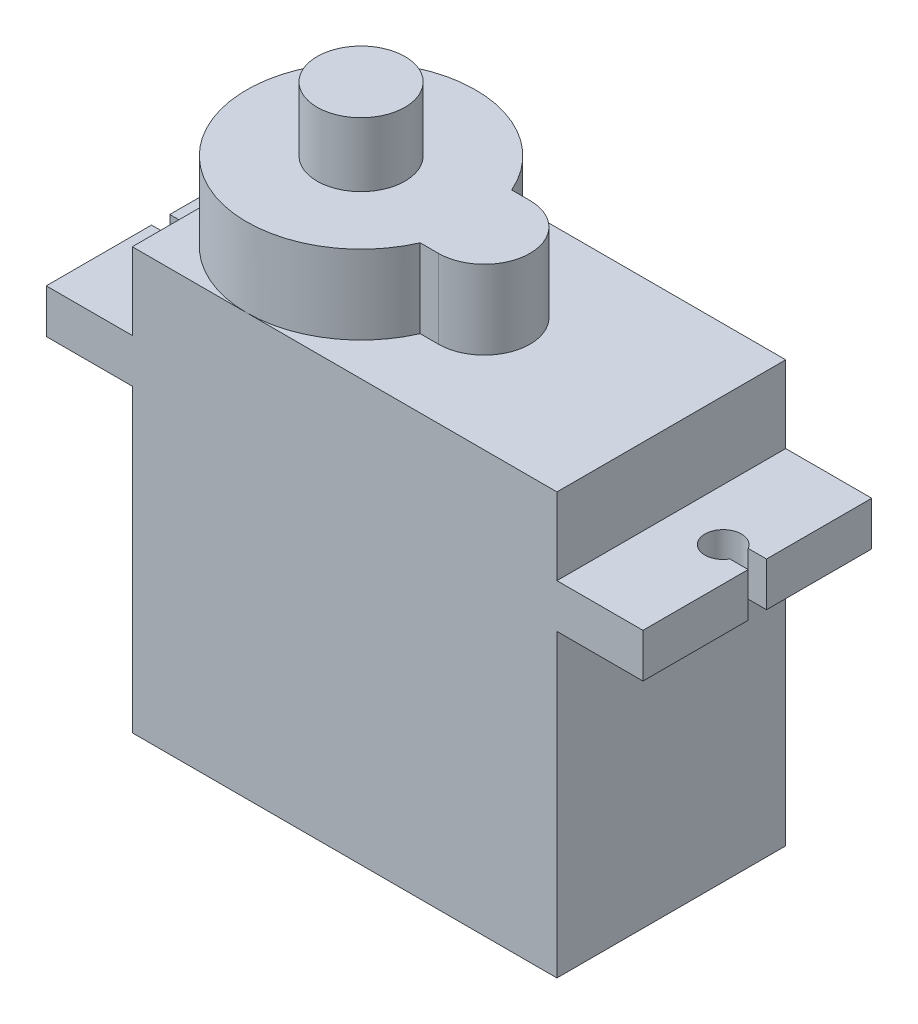
ISO-10303-21;
HEADER;
FILE_DESCRIPTION(('STEP AP214'),'2;1');
FILE_NAME('part.step','',(''),(''),'','','');
FILE_SCHEMA(('AUTOMOTIVE_DESIGN { 1 0 10303 214 1 1 1 1 }'));
ENDSEC;
DATA;
#1=APPLICATION_CONTEXT('core data for automotive mechanical design processes');
#2=APPLICATION_PROTOCOL_DEFINITION('international standard','automotive_design',2000,#1);
#3=PRODUCT_CONTEXT('',#1,'mechanical');
#4=PRODUCT('Part','Part','',(#3));
#5=PRODUCT_RELATED_PRODUCT_CATEGORY('part','',(#4));
#6=PRODUCT_DEFINITION_FORMATION('','',#4);
#7=PRODUCT_DEFINITION_CONTEXT('part definition',#1,'design');
#8=PRODUCT_DEFINITION('design','',#6,#7);
#9=PRODUCT_DEFINITION_SHAPE('','',#8);
#10=(LENGTH_UNIT() NAMED_UNIT(*) SI_UNIT(.MILLI.,.METRE.));
#11=(NAMED_UNIT(*) PLANE_ANGLE_UNIT() SI_UNIT($,.RADIAN.));
#12=(NAMED_UNIT(*) SI_UNIT($,.STERADIAN.) SOLID_ANGLE_UNIT());
#13=UNCERTAINTY_MEASURE_WITH_UNIT(LENGTH_MEASURE(1.E-05),#10,'distance_accuracy_value','');
#14=(GEOMETRIC_REPRESENTATION_CONTEXT(3) GLOBAL_UNCERTAINTY_ASSIGNED_CONTEXT((#13)) GLOBAL_UNIT_ASSIGNED_CONTEXT((#10,
#11,#12)) REPRESENTATION_CONTEXT('',''));
#15=CARTESIAN_POINT('',(0.,0.,0.));
#16=DIRECTION('',(0.,0.,1.));
#17=DIRECTION('',(1.,0.,0.));
#18=AXIS2_PLACEMENT_3D('',#15,#16,#17);
#19=CARTESIAN_POINT('',(27.9,16.4,12.5));
#20=DIRECTION('',(-1.,0.,0.));
#21=DIRECTION('',(0.,0.,1.));
#22=AXIS2_PLACEMENT_3D('',#19,#20,#21);
#23=PLANE('',#22);
#24=DIRECTION('',(0.,0.,-1.));
#25=VECTOR('',#24,1.);
#26=CARTESIAN_POINT('',(27.9,18.8,12.5));
#27=LINE('',#26,#25);
#28=CARTESIAN_POINT('',(27.9,18.8,5.75));
#29=VERTEX_POINT('',#28);
#30=CARTESIAN_POINT('',(27.9,18.8,0.));
#31=VERTEX_POINT('',#30);
#32=EDGE_CURVE('E268',#29,#31,#27,.T.);
#33=ORIENTED_EDGE('',*,*,#32,.F.);
#34=DIRECTION('',(0.,1.,0.));
#35=VECTOR('',#34,1.);
#36=CARTESIAN_POINT('',(27.9,-0.001000000000001,5.75));
#37=LINE('',#36,#35);
#38=CARTESIAN_POINT('',(27.9,16.4,5.75));
#39=VERTEX_POINT('',#38);
#40=EDGE_CURVE('E435',#39,#29,#37,.T.);
#41=ORIENTED_EDGE('',*,*,#40,.F.);
#42=DIRECTION('',(0.,0.,-1.));
#43=VECTOR('',#42,1.);
#44=CARTESIAN_POINT('',(27.9,16.4,12.5));
#45=LINE('',#44,#43);
#46=CARTESIAN_POINT('',(27.9,16.4,0.));
#47=VERTEX_POINT('',#46);
#48=EDGE_CURVE('E273',#39,#47,#45,.T.);
#49=ORIENTED_EDGE('',*,*,#48,.T.);
#50=DIRECTION('',(0.,1.,0.));
#51=VECTOR('',#50,1.);
#52=CARTESIAN_POINT('',(27.9,16.4,0.));
#53=LINE('',#52,#51);
#54=EDGE_CURVE('E417',#47,#31,#53,.T.);
#55=ORIENTED_EDGE('',*,*,#54,.T.);
#56=EDGE_LOOP('',(#33,#41,#49,#55));
#57=FACE_BOUND('',#56,.T.);
#58=ADVANCED_FACE('F39',(#57),#23,.F.);
#59=CARTESIAN_POINT('',(-4.7,18.8,12.5));
#60=DIRECTION('',(1.,0.,0.));
#61=DIRECTION('',(0.,1.,0.));
#62=AXIS2_PLACEMENT_3D('',#59,#60,#61);
#63=PLANE('',#62);
#64=DIRECTION('',(0.,0.,-1.));
#65=VECTOR('',#64,1.);
#66=CARTESIAN_POINT('',(-4.7,16.4,12.5));
#67=LINE('',#66,#65);
#68=CARTESIAN_POINT('',(-4.7,16.4,5.75));
#69=VERTEX_POINT('',#68);
#70=CARTESIAN_POINT('',(-4.7,16.4,0.));
#71=VERTEX_POINT('',#70);
#72=EDGE_CURVE('E241',#69,#71,#67,.T.);
#73=ORIENTED_EDGE('',*,*,#72,.F.);
#74=DIRECTION('',(0.,1.,0.));
#75=VECTOR('',#74,1.);
#76=CARTESIAN_POINT('',(-4.7,-0.001000000000001,5.75));
#77=LINE('',#76,#75);
#78=CARTESIAN_POINT('',(-4.7,18.8,5.75));
#79=VERTEX_POINT('',#78);
#80=EDGE_CURVE('E222',#69,#79,#77,.T.);
#81=ORIENTED_EDGE('',*,*,#80,.T.);
#82=DIRECTION('',(0.,0.,-1.));
#83=VECTOR('',#82,1.);
#84=CARTESIAN_POINT('',(-4.7,18.8,12.5));
#85=LINE('',#84,#83);
#86=CARTESIAN_POINT('',(-4.7,18.8,0.));
#87=VERTEX_POINT('',#86);
#88=EDGE_CURVE('E240',#79,#87,#85,.T.);
#89=ORIENTED_EDGE('',*,*,#88,.T.);
#90=DIRECTION('',(0.,-1.,0.));
#91=VECTOR('',#90,1.);
#92=CARTESIAN_POINT('',(-4.7,18.8,0.));
#93=LINE('',#92,#91);
#94=EDGE_CURVE('E353',#87,#71,#93,.T.);
#95=ORIENTED_EDGE('',*,*,#94,.T.);
#96=EDGE_LOOP('',(#73,#81,#89,#95));
#97=FACE_BOUND('',#96,.T.);
#98=ADVANCED_FACE('F474',(#97),#63,.F.);
#99=CARTESIAN_POINT('',(0.,23.,12.5));
#100=DIRECTION('',(0.,-1.,0.));
#101=DIRECTION('',(0.,0.,-1.));
#102=AXIS2_PLACEMENT_3D('',#99,#100,#101);
#103=PLANE('',#102);
#104=CARTESIAN_POINT('',(6.25,23.,6.25));
#105=DIRECTION('',(0.,1.,0.));
#106=DIRECTION('',(0.,0.,1.));
#107=AXIS2_PLACEMENT_3D('',#104,#105,#106);
#108=CIRCLE('',#107,6.25);
#109=CARTESIAN_POINT('',(11.9782196186948,23.,3.75));
#110=VERTEX_POINT('',#109);
#111=CARTESIAN_POINT('',(6.25,23.,0.));
#112=VERTEX_POINT('',#111);
#113=EDGE_CURVE('E298',#110,#112,#108,.T.);
#114=ORIENTED_EDGE('',*,*,#113,.F.);
#115=DIRECTION('',(-1.,0.,0.));
#116=VECTOR('',#115,1.);
#117=CARTESIAN_POINT('',(11.9782196186948,23.,3.75));
#118=LINE('',#117,#116);
#119=CARTESIAN_POINT('',(12.9782196186948,23.,3.75));
#120=VERTEX_POINT('',#119);
#121=EDGE_CURVE('E765',#120,#110,#118,.T.);
#122=ORIENTED_EDGE('',*,*,#121,.F.);
#123=CARTESIAN_POINT('',(12.9782196186948,23.,6.25));
#124=DIRECTION('',(0.,1.,0.));
#125=DIRECTION('',(0.,0.,1.));
#126=AXIS2_PLACEMENT_3D('',#123,#124,#125);
#127=CIRCLE('',#126,2.5);
#128=CARTESIAN_POINT('',(12.9782196186948,23.,8.75));
#129=VERTEX_POINT('',#128);
#130=EDGE_CURVE('E314',#129,#120,#127,.T.);
#131=ORIENTED_EDGE('',*,*,#130,.F.);
#132=DIRECTION('',(1.,0.,0.));
#133=VECTOR('',#132,1.);
#134=CARTESIAN_POINT('',(11.9782196186948,23.,8.75));
#135=LINE('',#134,#133);
#136=CARTESIAN_POINT('',(11.9782196186948,23.,8.75));
#137=VERTEX_POINT('',#136);
#138=EDGE_CURVE('E308',#137,#129,#135,.T.);
#139=ORIENTED_EDGE('',*,*,#138,.F.);
#140=CARTESIAN_POINT('',(6.25,23.,12.5));
#141=VERTEX_POINT('',#140);
#142=EDGE_CURVE('E290',#141,#137,#108,.T.);
#143=ORIENTED_EDGE('',*,*,#142,.F.);
#144=DIRECTION('',(-1.,0.,0.));
#145=VECTOR('',#144,1.);
#146=CARTESIAN_POINT('',(0.,23.,12.5));
#147=LINE('',#146,#145);
#148=CARTESIAN_POINT('',(23.2,23.,12.5));
#149=VERTEX_POINT('',#148);
#150=EDGE_CURVE('E389',#149,#141,#147,.T.);
#151=ORIENTED_EDGE('',*,*,#150,.F.);
#152=DIRECTION('',(0.,0.,-1.));
#153=VECTOR('',#152,1.);
#154=CARTESIAN_POINT('',(23.2,23.,12.5));
#155=LINE('',#154,#153);
#156=CARTESIAN_POINT('',(23.2,23.,0.));
#157=VERTEX_POINT('',#156);
#158=EDGE_CURVE('E260',#149,#157,#155,.T.);
#159=ORIENTED_EDGE('',*,*,#158,.T.);
#160=DIRECTION('',(-1.,0.,0.));
#161=VECTOR('',#160,1.);
#162=CARTESIAN_POINT('',(0.,23.,0.));
#163=LINE('',#162,#161);
#164=EDGE_CURVE('E332',#157,#112,#163,.T.);
#165=ORIENTED_EDGE('',*,*,#164,.T.);
#166=EDGE_LOOP('',(#114,#122,#131,#139,#143,#151,#159,#165));
#167=FACE_BOUND('',#166,.T.);
#168=ADVANCED_FACE('F339',(#167),#103,.F.);
#169=CARTESIAN_POINT('',(0.,23.,6.25));
#170=VERTEX_POINT('',#169);
#171=EDGE_CURVE('E49',#112,#170,#108,.T.);
#172=ORIENTED_EDGE('',*,*,#171,.F.);
#173=CARTESIAN_POINT('',(0.,23.,0.));
#174=VERTEX_POINT('',#173);
#175=EDGE_CURVE('E324',#112,#174,#163,.T.);
#176=ORIENTED_EDGE('',*,*,#175,.T.);
#177=DIRECTION('',(0.,0.,-1.));
#178=VECTOR('',#177,1.);
#179=CARTESIAN_POINT('',(0.,23.,12.5));
#180=LINE('',#179,#178);
#181=EDGE_CURVE('E255',#170,#174,#180,.T.);
#182=ORIENTED_EDGE('',*,*,#181,.F.);
#183=EDGE_LOOP('',(#172,#176,#182));
#184=FACE_BOUND('',#183,.T.);
#185=ADVANCED_FACE('F323',(#184),#103,.F.);
#186=EDGE_CURVE('E296',#170,#141,#108,.T.);
#187=ORIENTED_EDGE('',*,*,#186,.F.);
#188=CARTESIAN_POINT('',(0.,23.,12.5));
#189=VERTEX_POINT('',#188);
#190=EDGE_CURVE('E256',#189,#170,#180,.T.);
#191=ORIENTED_EDGE('',*,*,#190,.F.);
#192=EDGE_CURVE('E388',#141,#189,#147,.T.);
#193=ORIENTED_EDGE('',*,*,#192,.F.);
#194=EDGE_LOOP('',(#187,#191,#193));
#195=FACE_BOUND('',#194,.T.);
#196=ADVANCED_FACE('F462',(#195),#103,.F.);
#197=CARTESIAN_POINT('',(0.,16.4,12.5));
#198=DIRECTION('',(1.,0.,0.));
#199=DIRECTION('',(0.,1.,0.));
#200=AXIS2_PLACEMENT_3D('',#197,#198,#199);
#201=PLANE('',#200);
#202=DIRECTION('',(0.,-1.,0.));
#203=VECTOR('',#202,1.);
#204=CARTESIAN_POINT('',(0.,16.4,0.));
#205=LINE('',#204,#203);
#206=CARTESIAN_POINT('',(0.,16.4,0.));
#207=VERTEX_POINT('',#206);
#208=CARTESIAN_POINT('',(0.,0.,0.));
#209=VERTEX_POINT('',#208);
#210=EDGE_CURVE('E404',#207,#209,#205,.T.);
#211=ORIENTED_EDGE('',*,*,#210,.T.);
#212=DIRECTION('',(0.,0.,-1.));
#213=VECTOR('',#212,1.);
#214=CARTESIAN_POINT('',(0.,0.,12.5));
#215=LINE('',#214,#213);
#216=CARTESIAN_POINT('',(0.,0.,12.5));
#217=VERTEX_POINT('',#216);
#218=EDGE_CURVE('E43',#217,#209,#215,.T.);
#219=ORIENTED_EDGE('',*,*,#218,.F.);
#220=DIRECTION('',(0.,-1.,0.));
#221=VECTOR('',#220,1.);
#222=CARTESIAN_POINT('',(0.,16.4,12.5));
#223=LINE('',#222,#221);
#224=CARTESIAN_POINT('',(0.,16.4,12.5));
#225=VERTEX_POINT('',#224);
#226=EDGE_CURVE('E358',#225,#217,#223,.T.);
#227=ORIENTED_EDGE('',*,*,#226,.F.);
#228=DIRECTION('',(0.,0.,-1.));
#229=VECTOR('',#228,1.);
#230=CARTESIAN_POINT('',(0.,16.4,12.5));
#231=LINE('',#230,#229);
#232=EDGE_CURVE('E246',#225,#207,#231,.T.);
#233=ORIENTED_EDGE('',*,*,#232,.T.);
#234=EDGE_LOOP('',(#211,#219,#227,#233));
#235=FACE_BOUND('',#234,.T.);
#236=ADVANCED_FACE('F41',(#235),#201,.F.);
#237=CARTESIAN_POINT('',(0.,0.,12.5));
#238=DIRECTION('',(0.,1.,0.));
#239=DIRECTION('',(0.,0.,1.));
#240=AXIS2_PLACEMENT_3D('',#237,#238,#239);
#241=PLANE('',#240);
#242=DIRECTION('',(1.,0.,0.));
#243=VECTOR('',#242,1.);
#244=CARTESIAN_POINT('',(0.,0.,0.));
#245=LINE('',#244,#243);
#246=CARTESIAN_POINT('',(23.2,0.,0.));
#247=VERTEX_POINT('',#246);
#248=EDGE_CURVE('E407',#209,#247,#245,.T.);
#249=ORIENTED_EDGE('',*,*,#248,.T.);
#250=DIRECTION('',(0.,0.,-1.));
#251=VECTOR('',#250,1.);
#252=CARTESIAN_POINT('',(23.2,0.,12.5));
#253=LINE('',#252,#251);
#254=CARTESIAN_POINT('',(23.2,0.,12.5));
#255=VERTEX_POINT('',#254);
#256=EDGE_CURVE('E281',#255,#247,#253,.T.);
#257=ORIENTED_EDGE('',*,*,#256,.F.);
#258=DIRECTION('',(1.,0.,0.));
#259=VECTOR('',#258,1.);
#260=CARTESIAN_POINT('',(0.,0.,12.5));
#261=LINE('',#260,#259);
#262=EDGE_CURVE('E363',#217,#255,#261,.T.);
#263=ORIENTED_EDGE('',*,*,#262,.F.);
#264=ORIENTED_EDGE('',*,*,#218,.T.);
#265=EDGE_LOOP('',(#249,#257,#263,#264));
#266=FACE_BOUND('',#265,.T.);
#267=ADVANCED_FACE('F444',(#266),#241,.F.);
#268=CARTESIAN_POINT('',(23.2,0.,12.5));
#269=DIRECTION('',(-1.,0.,0.));
#270=DIRECTION('',(0.,0.,1.));
#271=AXIS2_PLACEMENT_3D('',#268,#269,#270);
#272=PLANE('',#271);
#273=DIRECTION('',(0.,1.,0.));
#274=VECTOR('',#273,1.);
#275=CARTESIAN_POINT('',(23.2,0.,0.));
#276=LINE('',#275,#274);
#277=CARTESIAN_POINT('',(23.2,16.4,0.));
#278=VERTEX_POINT('',#277);
#279=EDGE_CURVE('E410',#247,#278,#276,.T.);
#280=ORIENTED_EDGE('',*,*,#279,.T.);
#281=DIRECTION('',(0.,0.,-1.));
#282=VECTOR('',#281,1.);
#283=CARTESIAN_POINT('',(23.2,16.4,12.5));
#284=LINE('',#283,#282);
#285=CARTESIAN_POINT('',(23.2,16.4,12.5));
#286=VERTEX_POINT('',#285);
#287=EDGE_CURVE('E278',#286,#278,#284,.T.);
#288=ORIENTED_EDGE('',*,*,#287,.F.);
#289=DIRECTION('',(0.,1.,0.));
#290=VECTOR('',#289,1.);
#291=CARTESIAN_POINT('',(23.2,0.,12.5));
#292=LINE('',#291,#290);
#293=EDGE_CURVE('E368',#255,#286,#292,.T.);
#294=ORIENTED_EDGE('',*,*,#293,.F.);
#295=ORIENTED_EDGE('',*,*,#256,.T.);
#296=EDGE_LOOP('',(#280,#288,#294,#295));
#297=FACE_BOUND('',#296,.T.);
#298=ADVANCED_FACE('F443',(#297),#272,.F.);
#299=CARTESIAN_POINT('',(23.2,16.4,12.5));
#300=DIRECTION('',(0.,1.,0.));
#301=DIRECTION('',(0.,0.,1.));
#302=AXIS2_PLACEMENT_3D('',#299,#300,#301);
#303=PLANE('',#302);
#304=ORIENTED_EDGE('',*,*,#48,.F.);
#305=DIRECTION('',(1.,0.,0.));
#306=VECTOR('',#305,1.);
#307=CARTESIAN_POINT('',(27.9,16.4,5.75));
#308=LINE('',#307,#306);
#309=CARTESIAN_POINT('',(26.9,16.4,5.75));
#310=VERTEX_POINT('',#309);
#311=EDGE_CURVE('E737',#310,#39,#308,.T.);
#312=ORIENTED_EDGE('',*,*,#311,.F.);
#313=CARTESIAN_POINT('',(26.0339745962156,16.4,6.25));
#314=DIRECTION('',(0.,1.,0.));
#315=DIRECTION('',(0.,0.,1.));
#316=AXIS2_PLACEMENT_3D('',#313,#314,#315);
#317=CIRCLE('',#316,0.999999999999998);
#318=CARTESIAN_POINT('',(26.9,16.4,6.75));
#319=VERTEX_POINT('',#318);
#320=EDGE_CURVE('E736',#319,#310,#317,.F.);
#321=ORIENTED_EDGE('',*,*,#320,.F.);
#322=DIRECTION('',(-1.,0.,0.));
#323=VECTOR('',#322,1.);
#324=CARTESIAN_POINT('',(27.9,16.4,6.75));
#325=LINE('',#324,#323);
#326=CARTESIAN_POINT('',(27.9,16.4,6.75));
#327=VERTEX_POINT('',#326);
#328=EDGE_CURVE('E451',#327,#319,#325,.T.);
#329=ORIENTED_EDGE('',*,*,#328,.F.);
#330=CARTESIAN_POINT('',(27.9,16.4,12.5));
#331=VERTEX_POINT('',#330);
#332=EDGE_CURVE('E274',#331,#327,#45,.T.);
#333=ORIENTED_EDGE('',*,*,#332,.F.);
#334=DIRECTION('',(1.,0.,0.));
#335=VECTOR('',#334,1.);
#336=CARTESIAN_POINT('',(23.2,16.4,12.5));
#337=LINE('',#336,#335);
#338=EDGE_CURVE('E376',#286,#331,#337,.T.);
#339=ORIENTED_EDGE('',*,*,#338,.F.);
#340=ORIENTED_EDGE('',*,*,#287,.T.);
#341=DIRECTION('',(1.,0.,0.));
#342=VECTOR('',#341,1.);
#343=CARTESIAN_POINT('',(23.2,16.4,0.));
#344=LINE('',#343,#342);
#345=EDGE_CURVE('E413',#278,#47,#344,.T.);
#346=ORIENTED_EDGE('',*,*,#345,.T.);
#347=EDGE_LOOP('',(#304,#312,#321,#329,#333,#339,#340,#346));
#348=FACE_BOUND('',#347,.T.);
#349=ADVANCED_FACE('F439',(#348),#303,.F.);
#350=ORIENTED_EDGE('',*,*,#332,.T.);
#351=DIRECTION('',(0.,1.,0.));
#352=VECTOR('',#351,1.);
#353=CARTESIAN_POINT('',(27.9,-0.001000000000001,6.75));
#354=LINE('',#353,#352);
#355=CARTESIAN_POINT('',(27.9,18.8,6.75));
#356=VERTEX_POINT('',#355);
#357=EDGE_CURVE('E456',#327,#356,#354,.T.);
#358=ORIENTED_EDGE('',*,*,#357,.T.);
#359=CARTESIAN_POINT('',(27.9,18.8,12.5));
#360=VERTEX_POINT('',#359);
#361=EDGE_CURVE('E269',#360,#356,#27,.T.);
#362=ORIENTED_EDGE('',*,*,#361,.F.);
#363=DIRECTION('',(0.,1.,0.));
#364=VECTOR('',#363,1.);
#365=CARTESIAN_POINT('',(27.9,16.4,12.5));
#366=LINE('',#365,#364);
#367=EDGE_CURVE('E379',#331,#360,#366,.T.);
#368=ORIENTED_EDGE('',*,*,#367,.F.);
#369=EDGE_LOOP('',(#350,#358,#362,#368));
#370=FACE_BOUND('',#369,.T.);
#371=ADVANCED_FACE('F454',(#370),#23,.F.);
#372=CARTESIAN_POINT('',(27.9,18.8,12.5));
#373=DIRECTION('',(0.,-1.,0.));
#374=DIRECTION('',(0.,0.,-1.));
#375=AXIS2_PLACEMENT_3D('',#372,#373,#374);
#376=PLANE('',#375);
#377=CARTESIAN_POINT('',(26.0339745962156,18.8,6.25));
#378=DIRECTION('',(0.,1.,0.));
#379=DIRECTION('',(0.,0.,-1.));
#380=AXIS2_PLACEMENT_3D('',#377,#378,#379);
#381=CIRCLE('',#380,0.999999999999998);
#382=CARTESIAN_POINT('',(26.9,18.8,5.75));
#383=VERTEX_POINT('',#382);
#384=CARTESIAN_POINT('',(26.9,18.8,6.75));
#385=VERTEX_POINT('',#384);
#386=EDGE_CURVE('E57',#383,#385,#381,.T.);
#387=ORIENTED_EDGE('',*,*,#386,.F.);
#388=DIRECTION('',(-1.,0.,0.));
#389=VECTOR('',#388,1.);
#390=CARTESIAN_POINT('',(27.9,18.8,5.75));
#391=LINE('',#390,#389);
#392=EDGE_CURVE('E748',#29,#383,#391,.T.);
#393=ORIENTED_EDGE('',*,*,#392,.F.);
#394=ORIENTED_EDGE('',*,*,#32,.T.);
#395=DIRECTION('',(-1.,0.,0.));
#396=VECTOR('',#395,1.);
#397=CARTESIAN_POINT('',(27.9,18.8,0.));
#398=LINE('',#397,#396);
#399=CARTESIAN_POINT('',(23.2,18.8,0.));
#400=VERTEX_POINT('',#399);
#401=EDGE_CURVE('E420',#31,#400,#398,.T.);
#402=ORIENTED_EDGE('',*,*,#401,.T.);
#403=DIRECTION('',(0.,0.,-1.));
#404=VECTOR('',#403,1.);
#405=CARTESIAN_POINT('',(23.2,18.8,12.5));
#406=LINE('',#405,#404);
#407=CARTESIAN_POINT('',(23.2,18.8,12.5));
#408=VERTEX_POINT('',#407);
#409=EDGE_CURVE('E264',#408,#400,#406,.T.);
#410=ORIENTED_EDGE('',*,*,#409,.F.);
#411=DIRECTION('',(-1.,0.,0.));
#412=VECTOR('',#411,1.);
#413=CARTESIAN_POINT('',(27.9,18.8,12.5));
#414=LINE('',#413,#412);
#415=EDGE_CURVE('E382',#360,#408,#414,.T.);
#416=ORIENTED_EDGE('',*,*,#415,.F.);
#417=ORIENTED_EDGE('',*,*,#361,.T.);
#418=DIRECTION('',(1.,0.,0.));
#419=VECTOR('',#418,1.);
#420=CARTESIAN_POINT('',(27.9,18.8,6.75));
#421=LINE('',#420,#419);
#422=EDGE_CURVE('E745',#385,#356,#421,.T.);
#423=ORIENTED_EDGE('',*,*,#422,.F.);
#424=EDGE_LOOP('',(#387,#393,#394,#402,#410,#416,#417,#423));
#425=FACE_BOUND('',#424,.T.);
#426=ADVANCED_FACE('F458',(#425),#376,.F.);
#427=CARTESIAN_POINT('',(23.2,23.,12.5));
#428=DIRECTION('',(-1.,0.,0.));
#429=DIRECTION('',(0.,0.,1.));
#430=AXIS2_PLACEMENT_3D('',#427,#428,#429);
#431=PLANE('',#430);
#432=DIRECTION('',(0.,1.,0.));
#433=VECTOR('',#432,1.);
#434=CARTESIAN_POINT('',(23.2,23.,0.));
#435=LINE('',#434,#433);
#436=EDGE_CURVE('E336',#400,#157,#435,.T.);
#437=ORIENTED_EDGE('',*,*,#436,.T.);
#438=ORIENTED_EDGE('',*,*,#158,.F.);
#439=DIRECTION('',(0.,1.,0.));
#440=VECTOR('',#439,1.);
#441=CARTESIAN_POINT('',(23.2,23.,12.5));
#442=LINE('',#441,#440);
#443=EDGE_CURVE('E385',#408,#149,#442,.T.);
#444=ORIENTED_EDGE('',*,*,#443,.F.);
#445=ORIENTED_EDGE('',*,*,#409,.T.);
#446=EDGE_LOOP('',(#437,#438,#444,#445));
#447=FACE_BOUND('',#446,.T.);
#448=ADVANCED_FACE('F427',(#447),#431,.F.);
#449=CARTESIAN_POINT('',(0.,18.8,12.5));
#450=DIRECTION('',(1.,0.,0.));
#451=DIRECTION('',(0.,1.,0.));
#452=AXIS2_PLACEMENT_3D('',#449,#450,#451);
#453=PLANE('',#452);
#454=DIRECTION('',(0.,-1.,0.));
#455=VECTOR('',#454,1.);
#456=CARTESIAN_POINT('',(0.,18.8,0.));
#457=LINE('',#456,#455);
#458=CARTESIAN_POINT('',(0.,18.8,0.));
#459=VERTEX_POINT('',#458);
#460=EDGE_CURVE('E334',#174,#459,#457,.T.);
#461=ORIENTED_EDGE('',*,*,#460,.T.);
#462=DIRECTION('',(0.,0.,-1.));
#463=VECTOR('',#462,1.);
#464=CARTESIAN_POINT('',(0.,18.8,12.5));
#465=LINE('',#464,#463);
#466=CARTESIAN_POINT('',(0.,18.8,12.5));
#467=VERTEX_POINT('',#466);
#468=EDGE_CURVE('E251',#467,#459,#465,.T.);
#469=ORIENTED_EDGE('',*,*,#468,.F.);
#470=DIRECTION('',(0.,-1.,0.));
#471=VECTOR('',#470,1.);
#472=CARTESIAN_POINT('',(0.,18.8,12.5));
#473=LINE('',#472,#471);
#474=EDGE_CURVE('E393',#189,#467,#473,.T.);
#475=ORIENTED_EDGE('',*,*,#474,.F.);
#476=ORIENTED_EDGE('',*,*,#190,.T.);
#477=ORIENTED_EDGE('',*,*,#181,.T.);
#478=EDGE_LOOP('',(#461,#469,#475,#476,#477));
#479=FACE_BOUND('',#478,.T.);
#480=ADVANCED_FACE('F529',(#479),#453,.F.);
#481=CARTESIAN_POINT('',(0.,18.8,12.5));
#482=DIRECTION('',(0.,-1.,0.));
#483=DIRECTION('',(0.,0.,-1.));
#484=AXIS2_PLACEMENT_3D('',#481,#482,#483);
#485=PLANE('',#484);
#486=ORIENTED_EDGE('',*,*,#88,.F.);
#487=DIRECTION('',(-1.,0.,0.));
#488=VECTOR('',#487,1.);
#489=CARTESIAN_POINT('',(-4.7,18.8,5.75));
#490=LINE('',#489,#488);
#491=CARTESIAN_POINT('',(-3.7,18.8,5.75));
#492=VERTEX_POINT('',#491);
#493=EDGE_CURVE('E234',#492,#79,#490,.T.);
#494=ORIENTED_EDGE('',*,*,#493,.F.);
#495=CARTESIAN_POINT('',(-2.83397459621556,18.8,6.25));
#496=DIRECTION('',(0.,1.,0.));
#497=DIRECTION('',(0.,0.,1.));
#498=AXIS2_PLACEMENT_3D('',#495,#496,#497);
#499=CIRCLE('',#498,1.);
#500=CARTESIAN_POINT('',(-3.7,18.8,6.75));
#501=VERTEX_POINT('',#500);
#502=EDGE_CURVE('E804',#501,#492,#499,.T.);
#503=ORIENTED_EDGE('',*,*,#502,.F.);
#504=DIRECTION('',(1.,0.,0.));
#505=VECTOR('',#504,1.);
#506=CARTESIAN_POINT('',(-4.7,18.8,6.75));
#507=LINE('',#506,#505);
#508=CARTESIAN_POINT('',(-4.7,18.8,6.75));
#509=VERTEX_POINT('',#508);
#510=EDGE_CURVE('E801',#509,#501,#507,.T.);
#511=ORIENTED_EDGE('',*,*,#510,.F.);
#512=CARTESIAN_POINT('',(-4.7,18.8,12.5));
#513=VERTEX_POINT('',#512);
#514=EDGE_CURVE('E232',#513,#509,#85,.T.);
#515=ORIENTED_EDGE('',*,*,#514,.F.);
#516=DIRECTION('',(-1.,0.,0.));
#517=VECTOR('',#516,1.);
#518=CARTESIAN_POINT('',(0.,18.8,12.5));
#519=LINE('',#518,#517);
#520=EDGE_CURVE('E396',#467,#513,#519,.T.);
#521=ORIENTED_EDGE('',*,*,#520,.F.);
#522=ORIENTED_EDGE('',*,*,#468,.T.);
#523=DIRECTION('',(-1.,0.,0.));
#524=VECTOR('',#523,1.);
#525=CARTESIAN_POINT('',(0.,18.8,0.));
#526=LINE('',#525,#524);
#527=EDGE_CURVE('E345',#459,#87,#526,.T.);
#528=ORIENTED_EDGE('',*,*,#527,.T.);
#529=EDGE_LOOP('',(#486,#494,#503,#511,#515,#521,#522,#528));
#530=FACE_BOUND('',#529,.T.);
#531=ADVANCED_FACE('F538',(#530),#485,.F.);
#532=ORIENTED_EDGE('',*,*,#514,.T.);
#533=DIRECTION('',(0.,1.,0.));
#534=VECTOR('',#533,1.);
#535=CARTESIAN_POINT('',(-4.7,-0.001000000000001,6.75));
#536=LINE('',#535,#534);
#537=CARTESIAN_POINT('',(-4.7,16.4,6.75));
#538=VERTEX_POINT('',#537);
#539=EDGE_CURVE('E215',#538,#509,#536,.T.);
#540=ORIENTED_EDGE('',*,*,#539,.F.);
#541=CARTESIAN_POINT('',(-4.7,16.4,12.5));
#542=VERTEX_POINT('',#541);
#543=EDGE_CURVE('E229',#542,#538,#67,.T.);
#544=ORIENTED_EDGE('',*,*,#543,.F.);
#545=DIRECTION('',(0.,-1.,0.));
#546=VECTOR('',#545,1.);
#547=CARTESIAN_POINT('',(-4.7,18.8,12.5));
#548=LINE('',#547,#546);
#549=EDGE_CURVE('E399',#513,#542,#548,.T.);
#550=ORIENTED_EDGE('',*,*,#549,.F.);
#551=EDGE_LOOP('',(#532,#540,#544,#550));
#552=FACE_BOUND('',#551,.T.);
#553=ADVANCED_FACE('F227',(#552),#63,.F.);
#554=CARTESIAN_POINT('',(-4.7,16.4,12.5));
#555=DIRECTION('',(0.,1.,0.));
#556=DIRECTION('',(0.,0.,1.));
#557=AXIS2_PLACEMENT_3D('',#554,#555,#556);
#558=PLANE('',#557);
#559=CARTESIAN_POINT('',(-2.83397459621556,16.4,6.25));
#560=DIRECTION('',(0.,1.,0.));
#561=DIRECTION('',(0.,0.,1.));
#562=AXIS2_PLACEMENT_3D('',#559,#560,#561);
#563=CIRCLE('',#562,1.);
#564=CARTESIAN_POINT('',(-3.7,16.4,5.75));
#565=VERTEX_POINT('',#564);
#566=CARTESIAN_POINT('',(-3.7,16.4,6.75));
#567=VERTEX_POINT('',#566);
#568=EDGE_CURVE('E65',#565,#567,#563,.F.);
#569=ORIENTED_EDGE('',*,*,#568,.F.);
#570=DIRECTION('',(1.,0.,0.));
#571=VECTOR('',#570,1.);
#572=CARTESIAN_POINT('',(-4.7,16.4,5.75));
#573=LINE('',#572,#571);
#574=EDGE_CURVE('E797',#69,#565,#573,.T.);
#575=ORIENTED_EDGE('',*,*,#574,.F.);
#576=ORIENTED_EDGE('',*,*,#72,.T.);
#577=DIRECTION('',(1.,0.,0.));
#578=VECTOR('',#577,1.);
#579=CARTESIAN_POINT('',(-4.7,16.4,0.));
#580=LINE('',#579,#578);
#581=EDGE_CURVE('E356',#71,#207,#580,.T.);
#582=ORIENTED_EDGE('',*,*,#581,.T.);
#583=ORIENTED_EDGE('',*,*,#232,.F.);
#584=DIRECTION('',(1.,0.,0.));
#585=VECTOR('',#584,1.);
#586=CARTESIAN_POINT('',(-4.7,16.4,12.5));
#587=LINE('',#586,#585);
#588=EDGE_CURVE('E238',#542,#225,#587,.T.);
#589=ORIENTED_EDGE('',*,*,#588,.F.);
#590=ORIENTED_EDGE('',*,*,#543,.T.);
#591=DIRECTION('',(-1.,0.,0.));
#592=VECTOR('',#591,1.);
#593=CARTESIAN_POINT('',(-4.7,16.4,6.75));
#594=LINE('',#593,#592);
#595=EDGE_CURVE('E211',#567,#538,#594,.T.);
#596=ORIENTED_EDGE('',*,*,#595,.F.);
#597=EDGE_LOOP('',(#569,#575,#576,#582,#583,#589,#590,#596));
#598=FACE_BOUND('',#597,.T.);
#599=ADVANCED_FACE('F236',(#598),#558,.F.);
#600=CARTESIAN_POINT('',(0.,0.,12.5));
#601=DIRECTION('',(0.,0.,1.));
#602=DIRECTION('',(1.,0.,0.));
#603=AXIS2_PLACEMENT_3D('',#600,#601,#602);
#604=PLANE('',#603);
#605=ORIENTED_EDGE('',*,*,#226,.T.);
#606=ORIENTED_EDGE('',*,*,#262,.T.);
#607=ORIENTED_EDGE('',*,*,#293,.T.);
#608=ORIENTED_EDGE('',*,*,#338,.T.);
#609=ORIENTED_EDGE('',*,*,#367,.T.);
#610=ORIENTED_EDGE('',*,*,#415,.T.);
#611=ORIENTED_EDGE('',*,*,#443,.T.);
#612=ORIENTED_EDGE('',*,*,#150,.T.);
#613=ORIENTED_EDGE('',*,*,#192,.T.);
#614=ORIENTED_EDGE('',*,*,#474,.T.);
#615=ORIENTED_EDGE('',*,*,#520,.T.);
#616=ORIENTED_EDGE('',*,*,#549,.T.);
#617=ORIENTED_EDGE('',*,*,#588,.T.);
#618=EDGE_LOOP('',(#605,#606,#607,#608,#609,#610,#611,#612,#613,#614,#615,#616,#617));
#619=FACE_BOUND('',#618,.T.);
#620=ADVANCED_FACE('F445',(#619),#604,.T.);
#621=CARTESIAN_POINT('',(0.,0.,0.));
#622=DIRECTION('',(0.,0.,1.));
#623=DIRECTION('',(1.,0.,0.));
#624=AXIS2_PLACEMENT_3D('',#621,#622,#623);
#625=PLANE('',#624);
#626=ORIENTED_EDGE('',*,*,#210,.F.);
#627=ORIENTED_EDGE('',*,*,#581,.F.);
#628=ORIENTED_EDGE('',*,*,#94,.F.);
#629=ORIENTED_EDGE('',*,*,#527,.F.);
#630=ORIENTED_EDGE('',*,*,#460,.F.);
#631=ORIENTED_EDGE('',*,*,#175,.F.);
#632=ORIENTED_EDGE('',*,*,#164,.F.);
#633=ORIENTED_EDGE('',*,*,#436,.F.);
#634=ORIENTED_EDGE('',*,*,#401,.F.);
#635=ORIENTED_EDGE('',*,*,#54,.F.);
#636=ORIENTED_EDGE('',*,*,#345,.F.);
#637=ORIENTED_EDGE('',*,*,#279,.F.);
#638=ORIENTED_EDGE('',*,*,#248,.F.);
#639=EDGE_LOOP('',(#626,#627,#628,#629,#630,#631,#632,#633,#634,#635,#636,#637,#638));
#640=FACE_BOUND('',#639,.T.);
#641=ADVANCED_FACE('F330',(#640),#625,.F.);
#642=CARTESIAN_POINT('',(6.25,27.3,6.25));
#643=DIRECTION('',(0.,-1.,0.));
#644=DIRECTION('',(0.,0.,-1.));
#645=AXIS2_PLACEMENT_3D('',#642,#643,#644);
#646=CYLINDRICAL_SURFACE('',#645,6.25);
#647=ORIENTED_EDGE('',*,*,#113,.T.);
#648=ORIENTED_EDGE('',*,*,#171,.T.);
#649=ORIENTED_EDGE('',*,*,#186,.T.);
#650=ORIENTED_EDGE('',*,*,#142,.T.);
#651=DIRECTION('',(0.,-1.,0.));
#652=VECTOR('',#651,1.);
#653=CARTESIAN_POINT('',(11.9782196186948,27.3,8.75));
#654=LINE('',#653,#652);
#655=CARTESIAN_POINT('',(11.9782196186948,27.3,8.75));
#656=VERTEX_POINT('',#655);
#657=EDGE_CURVE('E371',#656,#137,#654,.T.);
#658=ORIENTED_EDGE('',*,*,#657,.F.);
#659=CARTESIAN_POINT('',(6.25,27.3,6.25));
#660=DIRECTION('',(0.,1.,0.));
#661=DIRECTION('',(0.,0.,1.));
#662=AXIS2_PLACEMENT_3D('',#659,#660,#661);
#663=CIRCLE('',#662,6.25);
#664=CARTESIAN_POINT('',(11.9782196186948,27.3,3.75));
#665=VERTEX_POINT('',#664);
#666=EDGE_CURVE('E760',#665,#656,#663,.T.);
#667=ORIENTED_EDGE('',*,*,#666,.F.);
#668=DIRECTION('',(0.,-1.,0.));
#669=VECTOR('',#668,1.);
#670=CARTESIAN_POINT('',(11.9782196186948,27.3,3.75));
#671=LINE('',#670,#669);
#672=EDGE_CURVE('E772',#665,#110,#671,.T.);
#673=ORIENTED_EDGE('',*,*,#672,.T.);
#674=EDGE_LOOP('',(#647,#648,#649,#650,#658,#667,#673));
#675=FACE_BOUND('',#674,.T.);
#676=ADVANCED_FACE('F318',(#675),#646,.T.);
#677=CARTESIAN_POINT('',(11.9782196186948,27.3,8.75));
#678=DIRECTION('',(0.,0.,-1.));
#679=DIRECTION('',(-1.,0.,0.));
#680=AXIS2_PLACEMENT_3D('',#677,#678,#679);
#681=PLANE('',#680);
#682=ORIENTED_EDGE('',*,*,#138,.T.);
#683=DIRECTION('',(0.,-1.,0.));
#684=VECTOR('',#683,1.);
#685=CARTESIAN_POINT('',(12.9782196186948,27.3,8.75));
#686=LINE('',#685,#684);
#687=CARTESIAN_POINT('',(12.9782196186948,27.3,8.75));
#688=VERTEX_POINT('',#687);
#689=EDGE_CURVE('E782',#688,#129,#686,.T.);
#690=ORIENTED_EDGE('',*,*,#689,.F.);
#691=DIRECTION('',(1.,0.,0.));
#692=VECTOR('',#691,1.);
#693=CARTESIAN_POINT('',(11.9782196186948,27.3,8.75));
#694=LINE('',#693,#692);
#695=EDGE_CURVE('E764',#656,#688,#694,.T.);
#696=ORIENTED_EDGE('',*,*,#695,.F.);
#697=ORIENTED_EDGE('',*,*,#657,.T.);
#698=EDGE_LOOP('',(#682,#690,#696,#697));
#699=FACE_BOUND('',#698,.T.);
#700=ADVANCED_FACE('F598',(#699),#681,.F.);
#701=CARTESIAN_POINT('',(12.9782196186948,27.3,6.25));
#702=DIRECTION('',(0.,-1.,0.));
#703=DIRECTION('',(0.,0.,-1.));
#704=AXIS2_PLACEMENT_3D('',#701,#702,#703);
#705=CYLINDRICAL_SURFACE('',#704,2.5);
#706=ORIENTED_EDGE('',*,*,#130,.T.);
#707=DIRECTION('',(0.,-1.,0.));
#708=VECTOR('',#707,1.);
#709=CARTESIAN_POINT('',(12.9782196186948,27.3,3.75));
#710=LINE('',#709,#708);
#711=CARTESIAN_POINT('',(12.9782196186948,27.3,3.75));
#712=VERTEX_POINT('',#711);
#713=EDGE_CURVE('E777',#712,#120,#710,.T.);
#714=ORIENTED_EDGE('',*,*,#713,.F.);
#715=CARTESIAN_POINT('',(12.9782196186948,27.3,6.25));
#716=DIRECTION('',(0.,1.,0.));
#717=DIRECTION('',(0.,0.,1.));
#718=AXIS2_PLACEMENT_3D('',#715,#716,#717);
#719=CIRCLE('',#718,2.5);
#720=EDGE_CURVE('E768',#688,#712,#719,.T.);
#721=ORIENTED_EDGE('',*,*,#720,.F.);
#722=ORIENTED_EDGE('',*,*,#689,.T.);
#723=EDGE_LOOP('',(#706,#714,#721,#722));
#724=FACE_BOUND('',#723,.T.);
#725=ADVANCED_FACE('F606',(#724),#705,.T.);
#726=CARTESIAN_POINT('',(11.9782196186948,27.3,3.75));
#727=DIRECTION('',(0.,0.,1.));
#728=DIRECTION('',(1.,0.,0.));
#729=AXIS2_PLACEMENT_3D('',#726,#727,#728);
#730=PLANE('',#729);
#731=ORIENTED_EDGE('',*,*,#121,.T.);
#732=ORIENTED_EDGE('',*,*,#672,.F.);
#733=DIRECTION('',(-1.,0.,0.));
#734=VECTOR('',#733,1.);
#735=CARTESIAN_POINT('',(11.9782196186948,27.3,3.75));
#736=LINE('',#735,#734);
#737=EDGE_CURVE('E770',#712,#665,#736,.T.);
#738=ORIENTED_EDGE('',*,*,#737,.F.);
#739=ORIENTED_EDGE('',*,*,#713,.T.);
#740=EDGE_LOOP('',(#731,#732,#738,#739));
#741=FACE_BOUND('',#740,.T.);
#742=ADVANCED_FACE('F615',(#741),#730,.F.);
#743=CARTESIAN_POINT('',(6.25,27.3,6.25));
#744=DIRECTION('',(0.,1.,0.));
#745=DIRECTION('',(0.,0.,1.));
#746=AXIS2_PLACEMENT_3D('',#743,#744,#745);
#747=PLANE('',#746);
#748=CARTESIAN_POINT('',(6.25,27.3,6.25));
#749=DIRECTION('',(0.,1.,0.));
#750=DIRECTION('',(0.,0.,1.));
#751=AXIS2_PLACEMENT_3D('',#748,#749,#750);
#752=CIRCLE('',#751,2.4);
#753=CARTESIAN_POINT('',(6.25,27.3,8.65));
#754=VERTEX_POINT('',#753);
#755=EDGE_CURVE('E11',#754,#754,#752,.T.);
#756=ORIENTED_EDGE('',*,*,#755,.F.);
#757=EDGE_LOOP('',(#756));
#758=FACE_BOUND('',#757,.T.);
#759=ORIENTED_EDGE('',*,*,#666,.T.);
#760=ORIENTED_EDGE('',*,*,#695,.T.);
#761=ORIENTED_EDGE('',*,*,#720,.T.);
#762=ORIENTED_EDGE('',*,*,#737,.T.);
#763=EDGE_LOOP('',(#759,#760,#761,#762));
#764=FACE_BOUND('',#763,.T.);
#765=ADVANCED_FACE('F624',(#758,#764),#747,.T.);
#766=CARTESIAN_POINT('',(6.25,30.8,6.25));
#767=DIRECTION('',(0.,-1.,0.));
#768=DIRECTION('',(0.,0.,-1.));
#769=AXIS2_PLACEMENT_3D('',#766,#767,#768);
#770=CYLINDRICAL_SURFACE('',#769,2.4);
#771=CARTESIAN_POINT('',(6.25,30.8,6.25));
#772=DIRECTION('',(0.,1.,0.));
#773=DIRECTION('',(0.,0.,1.));
#774=AXIS2_PLACEMENT_3D('',#771,#772,#773);
#775=CIRCLE('',#774,2.4);
#776=CARTESIAN_POINT('',(6.25,30.8,8.65));
#777=VERTEX_POINT('',#776);
#778=EDGE_CURVE('E221',#777,#777,#775,.T.);
#779=ORIENTED_EDGE('',*,*,#778,.F.);
#780=EDGE_LOOP('',(#779));
#781=FACE_BOUND('',#780,.T.);
#782=ORIENTED_EDGE('',*,*,#755,.T.);
#783=EDGE_LOOP('',(#782));
#784=FACE_BOUND('',#783,.T.);
#785=ADVANCED_FACE('F633',(#781,#784),#770,.T.);
#786=CARTESIAN_POINT('',(6.25,30.8,6.25));
#787=DIRECTION('',(0.,1.,0.));
#788=DIRECTION('',(0.,0.,1.));
#789=AXIS2_PLACEMENT_3D('',#786,#787,#788);
#790=PLANE('',#789);
#791=ORIENTED_EDGE('',*,*,#778,.T.);
#792=EDGE_LOOP('',(#791));
#793=FACE_BOUND('',#792,.T.);
#794=ADVANCED_FACE('F642',(#793),#790,.T.);
#795=CARTESIAN_POINT('',(-4.7,-0.001000000000001,5.75));
#796=DIRECTION('',(0.,0.,-1.));
#797=DIRECTION('',(-1.,0.,0.));
#798=AXIS2_PLACEMENT_3D('',#795,#796,#797);
#799=PLANE('',#798);
#800=ORIENTED_EDGE('',*,*,#574,.T.);
#801=DIRECTION('',(0.,1.,0.));
#802=VECTOR('',#801,1.);
#803=CARTESIAN_POINT('',(-3.7,-0.001000000000001,5.75));
#804=LINE('',#803,#802);
#805=EDGE_CURVE('E812',#565,#492,#804,.T.);
#806=ORIENTED_EDGE('',*,*,#805,.T.);
#807=ORIENTED_EDGE('',*,*,#493,.T.);
#808=ORIENTED_EDGE('',*,*,#80,.F.);
#809=EDGE_LOOP('',(#800,#806,#807,#808));
#810=FACE_BOUND('',#809,.T.);
#811=ADVANCED_FACE('F651',(#810),#799,.F.);
#812=CARTESIAN_POINT('',(-2.83397459621556,-0.001000000000001,6.25));
#813=DIRECTION('',(0.,1.,0.));
#814=DIRECTION('',(0.,0.,1.));
#815=AXIS2_PLACEMENT_3D('',#812,#813,#814);
#816=CYLINDRICAL_SURFACE('',#815,1.);
#817=ORIENTED_EDGE('',*,*,#568,.T.);
#818=DIRECTION('',(0.,1.,0.));
#819=VECTOR('',#818,1.);
#820=CARTESIAN_POINT('',(-3.7,-0.001000000000001,6.75));
#821=LINE('',#820,#819);
#822=EDGE_CURVE('E217',#567,#501,#821,.T.);
#823=ORIENTED_EDGE('',*,*,#822,.T.);
#824=ORIENTED_EDGE('',*,*,#502,.T.);
#825=ORIENTED_EDGE('',*,*,#805,.F.);
#826=EDGE_LOOP('',(#817,#823,#824,#825));
#827=FACE_BOUND('',#826,.T.);
#828=ADVANCED_FACE('F667',(#827),#816,.F.);
#829=CARTESIAN_POINT('',(-4.7,-0.001000000000001,6.75));
#830=DIRECTION('',(0.,0.,1.));
#831=DIRECTION('',(1.,0.,0.));
#832=AXIS2_PLACEMENT_3D('',#829,#830,#831);
#833=PLANE('',#832);
#834=ORIENTED_EDGE('',*,*,#595,.T.);
#835=ORIENTED_EDGE('',*,*,#539,.T.);
#836=ORIENTED_EDGE('',*,*,#510,.T.);
#837=ORIENTED_EDGE('',*,*,#822,.F.);
#838=EDGE_LOOP('',(#834,#835,#836,#837));
#839=FACE_BOUND('',#838,.T.);
#840=ADVANCED_FACE('F213',(#839),#833,.F.);
#841=CARTESIAN_POINT('',(26.0339745962156,-0.001000000000001,6.25));
#842=DIRECTION('',(0.,1.,0.));
#843=DIRECTION('',(0.,0.,1.));
#844=AXIS2_PLACEMENT_3D('',#841,#842,#843);
#845=CYLINDRICAL_SURFACE('',#844,0.999999999999998);
#846=ORIENTED_EDGE('',*,*,#320,.T.);
#847=DIRECTION('',(0.,1.,0.));
#848=VECTOR('',#847,1.);
#849=CARTESIAN_POINT('',(26.9,-0.001000000000001,5.75));
#850=LINE('',#849,#848);
#851=EDGE_CURVE('E733',#310,#383,#850,.T.);
#852=ORIENTED_EDGE('',*,*,#851,.T.);
#853=ORIENTED_EDGE('',*,*,#386,.T.);
#854=DIRECTION('',(0.,1.,0.));
#855=VECTOR('',#854,1.);
#856=CARTESIAN_POINT('',(26.9,-0.001000000000001,6.75));
#857=LINE('',#856,#855);
#858=EDGE_CURVE('E731',#319,#385,#857,.T.);
#859=ORIENTED_EDGE('',*,*,#858,.F.);
#860=EDGE_LOOP('',(#846,#852,#853,#859));
#861=FACE_BOUND('',#860,.T.);
#862=ADVANCED_FACE('F683',(#861),#845,.F.);
#863=CARTESIAN_POINT('',(27.9,-0.001000000000001,5.75));
#864=DIRECTION('',(0.,0.,-1.));
#865=DIRECTION('',(-1.,0.,0.));
#866=AXIS2_PLACEMENT_3D('',#863,#864,#865);
#867=PLANE('',#866);
#868=ORIENTED_EDGE('',*,*,#311,.T.);
#869=ORIENTED_EDGE('',*,*,#40,.T.);
#870=ORIENTED_EDGE('',*,*,#392,.T.);
#871=ORIENTED_EDGE('',*,*,#851,.F.);
#872=EDGE_LOOP('',(#868,#869,#870,#871));
#873=FACE_BOUND('',#872,.T.);
#874=ADVANCED_FACE('F691',(#873),#867,.F.);
#875=CARTESIAN_POINT('',(27.9,-0.001000000000001,6.75));
#876=DIRECTION('',(0.,0.,1.));
#877=DIRECTION('',(1.,0.,0.));
#878=AXIS2_PLACEMENT_3D('',#875,#876,#877);
#879=PLANE('',#878);
#880=ORIENTED_EDGE('',*,*,#328,.T.);
#881=ORIENTED_EDGE('',*,*,#858,.T.);
#882=ORIENTED_EDGE('',*,*,#422,.T.);
#883=ORIENTED_EDGE('',*,*,#357,.F.);
#884=EDGE_LOOP('',(#880,#881,#882,#883));
#885=FACE_BOUND('',#884,.T.);
#886=ADVANCED_FACE('F699',(#885),#879,.F.);
#887=CLOSED_SHELL('',(#58,#98,#168,#185,#196,#236,#267,#298,#349,#371,#426,#448,#480,#531,#553,
#599,#620,#641,#676,#700,#725,#742,#765,#785,#794,#811,#828,#840,#862,#874,#886));
#888=MANIFOLD_SOLID_BREP('B2',#887);
#889=ADVANCED_BREP_SHAPE_REPRESENTATION('',(#18,#888),#14);
#890=SHAPE_DEFINITION_REPRESENTATION(#9,#889);
ENDSEC;
END-ISO-10303-21;
